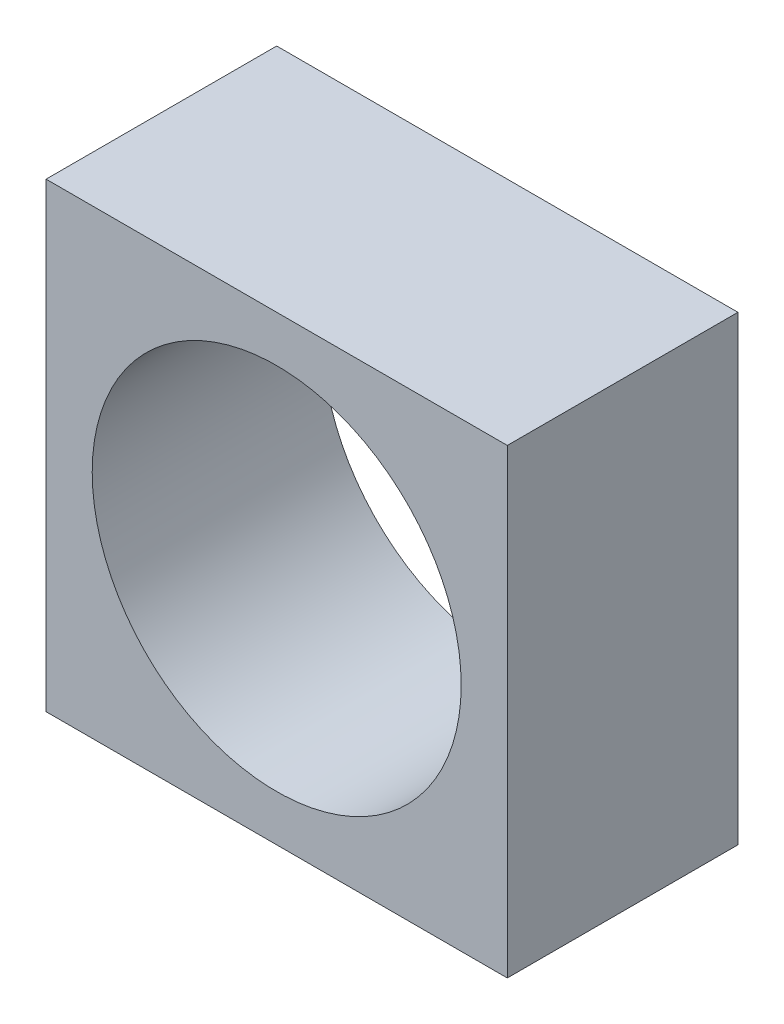
ISO-10303-21;
HEADER;
FILE_DESCRIPTION(('STEP AP214'),'2;1');
FILE_NAME('part.step','',(''),(''),'','','');
FILE_SCHEMA(('AUTOMOTIVE_DESIGN { 1 0 10303 214 1 1 1 1 }'));
ENDSEC;
DATA;
#1=APPLICATION_CONTEXT('core data for automotive mechanical design processes');
#2=APPLICATION_PROTOCOL_DEFINITION('international standard','automotive_design',2000,#1);
#3=PRODUCT_CONTEXT('',#1,'mechanical');
#4=PRODUCT('Part','Part','',(#3));
#5=PRODUCT_RELATED_PRODUCT_CATEGORY('part','',(#4));
#6=PRODUCT_DEFINITION_FORMATION('','',#4);
#7=PRODUCT_DEFINITION_CONTEXT('part definition',#1,'design');
#8=PRODUCT_DEFINITION('design','',#6,#7);
#9=PRODUCT_DEFINITION_SHAPE('','',#8);
#10=(LENGTH_UNIT() NAMED_UNIT(*) SI_UNIT(.MILLI.,.METRE.));
#11=(NAMED_UNIT(*) PLANE_ANGLE_UNIT() SI_UNIT($,.RADIAN.));
#12=(NAMED_UNIT(*) SI_UNIT($,.STERADIAN.) SOLID_ANGLE_UNIT());
#13=UNCERTAINTY_MEASURE_WITH_UNIT(LENGTH_MEASURE(1.E-05),#10,'distance_accuracy_value','');
#14=(GEOMETRIC_REPRESENTATION_CONTEXT(3) GLOBAL_UNCERTAINTY_ASSIGNED_CONTEXT((#13)) GLOBAL_UNIT_ASSIGNED_CONTEXT((#10,
#11,#12)) REPRESENTATION_CONTEXT('',''));
#15=CARTESIAN_POINT('',(0.,0.,0.));
#16=DIRECTION('',(0.,0.,1.));
#17=DIRECTION('',(1.,0.,0.));
#18=AXIS2_PLACEMENT_3D('',#15,#16,#17);
#19=CARTESIAN_POINT('',(0.,0.,10.));
#20=DIRECTION('',(0.,0.,-1.));
#21=DIRECTION('',(-1.,0.,0.));
#22=AXIS2_PLACEMENT_3D('',#19,#20,#21);
#23=PLANE('',#22);
#24=CARTESIAN_POINT('',(0.,0.,10.));
#25=DIRECTION('',(0.,0.,-1.));
#26=DIRECTION('',(-1.,0.,0.));
#27=AXIS2_PLACEMENT_3D('',#24,#25,#26);
#28=CIRCLE('',#27,8.);
#29=CARTESIAN_POINT('',(-8.,0.,10.));
#30=VERTEX_POINT('',#29);
#31=EDGE_CURVE('E252',#30,#30,#28,.T.);
#32=ORIENTED_EDGE('',*,*,#31,.T.);
#33=EDGE_LOOP('',(#32));
#34=FACE_BOUND('',#33,.T.);
#35=DIRECTION('',(0.,-1.,0.));
#36=VECTOR('',#35,1.);
#37=CARTESIAN_POINT('',(-10.,10.,10.));
#38=LINE('',#37,#36);
#39=CARTESIAN_POINT('',(-10.,10.,10.));
#40=VERTEX_POINT('',#39);
#41=CARTESIAN_POINT('',(-10.,-10.,10.));
#42=VERTEX_POINT('',#41);
#43=EDGE_CURVE('E116',#40,#42,#38,.T.);
#44=ORIENTED_EDGE('',*,*,#43,.T.);
#45=DIRECTION('',(1.,0.,0.));
#46=VECTOR('',#45,1.);
#47=CARTESIAN_POINT('',(10.,-10.,10.));
#48=LINE('',#47,#46);
#49=CARTESIAN_POINT('',(10.,-10.,10.));
#50=VERTEX_POINT('',#49);
#51=EDGE_CURVE('E118',#42,#50,#48,.T.);
#52=ORIENTED_EDGE('',*,*,#51,.T.);
#53=DIRECTION('',(0.,1.,0.));
#54=VECTOR('',#53,1.);
#55=CARTESIAN_POINT('',(10.,10.,10.));
#56=LINE('',#55,#54);
#57=CARTESIAN_POINT('',(10.,10.,10.));
#58=VERTEX_POINT('',#57);
#59=EDGE_CURVE('E52',#50,#58,#56,.T.);
#60=ORIENTED_EDGE('',*,*,#59,.T.);
#61=DIRECTION('',(-1.,0.,0.));
#62=VECTOR('',#61,1.);
#63=CARTESIAN_POINT('',(10.,10.,10.));
#64=LINE('',#63,#62);
#65=EDGE_CURVE('E12',#58,#40,#64,.T.);
#66=ORIENTED_EDGE('',*,*,#65,.T.);
#67=EDGE_LOOP('',(#44,#52,#60,#66));
#68=FACE_BOUND('',#67,.T.);
#69=ADVANCED_FACE('F43',(#34,#68),#23,.F.);
#70=CARTESIAN_POINT('',(0.,0.,0.));
#71=DIRECTION('',(0.,0.,-1.));
#72=DIRECTION('',(-1.,0.,0.));
#73=AXIS2_PLACEMENT_3D('',#70,#71,#72);
#74=PLANE('',#73);
#75=CARTESIAN_POINT('',(0.,0.,0.));
#76=DIRECTION('',(0.,0.,-1.));
#77=DIRECTION('',(-1.,0.,0.));
#78=AXIS2_PLACEMENT_3D('',#75,#76,#77);
#79=CIRCLE('',#78,8.);
#80=CARTESIAN_POINT('',(-8.,0.,0.));
#81=VERTEX_POINT('',#80);
#82=EDGE_CURVE('E47',#81,#81,#79,.T.);
#83=ORIENTED_EDGE('',*,*,#82,.F.);
#84=EDGE_LOOP('',(#83));
#85=FACE_BOUND('',#84,.T.);
#86=DIRECTION('',(0.,-1.,0.));
#87=VECTOR('',#86,1.);
#88=CARTESIAN_POINT('',(-10.,10.,0.));
#89=LINE('',#88,#87);
#90=CARTESIAN_POINT('',(-10.,10.,0.));
#91=VERTEX_POINT('',#90);
#92=CARTESIAN_POINT('',(-10.,-10.,0.));
#93=VERTEX_POINT('',#92);
#94=EDGE_CURVE('E110',#91,#93,#89,.T.);
#95=ORIENTED_EDGE('',*,*,#94,.F.);
#96=DIRECTION('',(-1.,0.,0.));
#97=VECTOR('',#96,1.);
#98=CARTESIAN_POINT('',(10.,10.,0.));
#99=LINE('',#98,#97);
#100=CARTESIAN_POINT('',(10.,10.,0.));
#101=VERTEX_POINT('',#100);
#102=EDGE_CURVE('E94',#101,#91,#99,.T.);
#103=ORIENTED_EDGE('',*,*,#102,.F.);
#104=DIRECTION('',(0.,1.,0.));
#105=VECTOR('',#104,1.);
#106=CARTESIAN_POINT('',(10.,10.,0.));
#107=LINE('',#106,#105);
#108=CARTESIAN_POINT('',(10.,-10.,0.));
#109=VERTEX_POINT('',#108);
#110=EDGE_CURVE('E85',#109,#101,#107,.T.);
#111=ORIENTED_EDGE('',*,*,#110,.F.);
#112=DIRECTION('',(1.,0.,0.));
#113=VECTOR('',#112,1.);
#114=CARTESIAN_POINT('',(10.,-10.,0.));
#115=LINE('',#114,#113);
#116=EDGE_CURVE('E90',#93,#109,#115,.T.);
#117=ORIENTED_EDGE('',*,*,#116,.F.);
#118=EDGE_LOOP('',(#95,#103,#111,#117));
#119=FACE_BOUND('',#118,.T.);
#120=ADVANCED_FACE('F89',(#85,#119),#74,.T.);
#121=CARTESIAN_POINT('',(0.,10.,0.));
#122=DIRECTION('',(0.,-1.,0.));
#123=DIRECTION('',(1.,0.,0.));
#124=AXIS2_PLACEMENT_3D('',#121,#122,#123);
#125=PLANE('',#124);
#126=DIRECTION('',(0.,0.,1.));
#127=VECTOR('',#126,1.);
#128=CARTESIAN_POINT('',(-10.,10.,0.));
#129=LINE('',#128,#127);
#130=EDGE_CURVE('E160',#91,#40,#129,.T.);
#131=ORIENTED_EDGE('',*,*,#130,.T.);
#132=ORIENTED_EDGE('',*,*,#65,.F.);
#133=DIRECTION('',(0.,0.,1.));
#134=VECTOR('',#133,1.);
#135=CARTESIAN_POINT('',(10.,10.,0.));
#136=LINE('',#135,#134);
#137=EDGE_CURVE('E67',#101,#58,#136,.T.);
#138=ORIENTED_EDGE('',*,*,#137,.F.);
#139=ORIENTED_EDGE('',*,*,#102,.T.);
#140=EDGE_LOOP('',(#131,#132,#138,#139));
#141=FACE_BOUND('',#140,.T.);
#142=ADVANCED_FACE('F141',(#141),#125,.F.);
#143=CARTESIAN_POINT('',(10.,0.,0.));
#144=DIRECTION('',(-1.,0.,0.));
#145=DIRECTION('',(0.,0.,1.));
#146=AXIS2_PLACEMENT_3D('',#143,#144,#145);
#147=PLANE('',#146);
#148=ORIENTED_EDGE('',*,*,#137,.T.);
#149=ORIENTED_EDGE('',*,*,#59,.F.);
#150=DIRECTION('',(0.,0.,1.));
#151=VECTOR('',#150,1.);
#152=CARTESIAN_POINT('',(10.,-10.,0.));
#153=LINE('',#152,#151);
#154=EDGE_CURVE('E106',#109,#50,#153,.T.);
#155=ORIENTED_EDGE('',*,*,#154,.F.);
#156=ORIENTED_EDGE('',*,*,#110,.T.);
#157=EDGE_LOOP('',(#148,#149,#155,#156));
#158=FACE_BOUND('',#157,.T.);
#159=ADVANCED_FACE('F114',(#158),#147,.F.);
#160=CARTESIAN_POINT('',(-10.,0.,0.));
#161=DIRECTION('',(1.,0.,0.));
#162=DIRECTION('',(0.,1.,0.));
#163=AXIS2_PLACEMENT_3D('',#160,#161,#162);
#164=PLANE('',#163);
#165=DIRECTION('',(0.,0.,1.));
#166=VECTOR('',#165,1.);
#167=CARTESIAN_POINT('',(-10.,-10.,0.));
#168=LINE('',#167,#166);
#169=EDGE_CURVE('E109',#93,#42,#168,.T.);
#170=ORIENTED_EDGE('',*,*,#169,.T.);
#171=ORIENTED_EDGE('',*,*,#43,.F.);
#172=ORIENTED_EDGE('',*,*,#130,.F.);
#173=ORIENTED_EDGE('',*,*,#94,.T.);
#174=EDGE_LOOP('',(#170,#171,#172,#173));
#175=FACE_BOUND('',#174,.T.);
#176=ADVANCED_FACE('F140',(#175),#164,.F.);
#177=CARTESIAN_POINT('',(0.,-10.,0.));
#178=DIRECTION('',(0.,1.,0.));
#179=DIRECTION('',(-1.,0.,0.));
#180=AXIS2_PLACEMENT_3D('',#177,#178,#179);
#181=PLANE('',#180);
#182=ORIENTED_EDGE('',*,*,#154,.T.);
#183=ORIENTED_EDGE('',*,*,#51,.F.);
#184=ORIENTED_EDGE('',*,*,#169,.F.);
#185=ORIENTED_EDGE('',*,*,#116,.T.);
#186=EDGE_LOOP('',(#182,#183,#184,#185));
#187=FACE_BOUND('',#186,.T.);
#188=ADVANCED_FACE('F105',(#187),#181,.F.);
#189=CARTESIAN_POINT('',(0.,0.,-0.0001));
#190=DIRECTION('',(0.,0.,1.));
#191=DIRECTION('',(1.,0.,0.));
#192=AXIS2_PLACEMENT_3D('',#189,#190,#191);
#193=CYLINDRICAL_SURFACE('',#192,8.);
#194=ORIENTED_EDGE('',*,*,#82,.T.);
#195=EDGE_LOOP('',(#194));
#196=FACE_BOUND('',#195,.T.);
#197=ORIENTED_EDGE('',*,*,#31,.F.);
#198=EDGE_LOOP('',(#197));
#199=FACE_BOUND('',#198,.T.);
#200=ADVANCED_FACE('F180',(#196,#199),#193,.F.);
#201=CLOSED_SHELL('',(#69,#120,#142,#159,#176,#188,#200));
#202=MANIFOLD_SOLID_BREP('B2',#201);
#203=ADVANCED_BREP_SHAPE_REPRESENTATION('',(#18,#202),#14);
#204=SHAPE_DEFINITION_REPRESENTATION(#9,#203);
ENDSEC;
END-ISO-10303-21;
